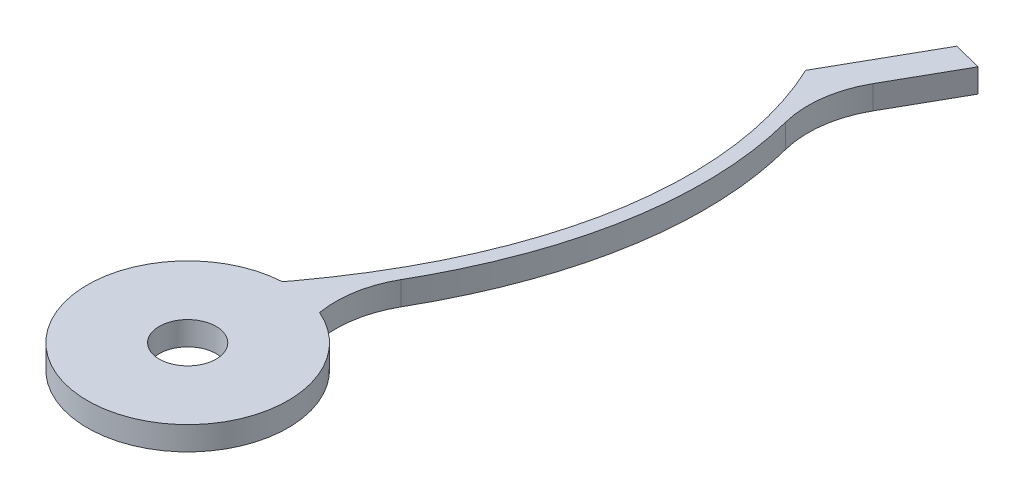
ISO-10303-21;
HEADER;
FILE_DESCRIPTION(('STEP AP214'),'2;1');
FILE_NAME('part.step','',(''),(''),'','','');
FILE_SCHEMA(('AUTOMOTIVE_DESIGN { 1 0 10303 214 1 1 1 1 }'));
ENDSEC;
DATA;
#1=APPLICATION_CONTEXT('core data for automotive mechanical design processes');
#2=APPLICATION_PROTOCOL_DEFINITION('international standard','automotive_design',2000,#1);
#3=PRODUCT_CONTEXT('',#1,'mechanical');
#4=PRODUCT('Part','Part','',(#3));
#5=PRODUCT_RELATED_PRODUCT_CATEGORY('part','',(#4));
#6=PRODUCT_DEFINITION_FORMATION('','',#4);
#7=PRODUCT_DEFINITION_CONTEXT('part definition',#1,'design');
#8=PRODUCT_DEFINITION('design','',#6,#7);
#9=PRODUCT_DEFINITION_SHAPE('','',#8);
#10=(LENGTH_UNIT() NAMED_UNIT(*) SI_UNIT(.MILLI.,.METRE.));
#11=(NAMED_UNIT(*) PLANE_ANGLE_UNIT() SI_UNIT($,.RADIAN.));
#12=(NAMED_UNIT(*) SI_UNIT($,.STERADIAN.) SOLID_ANGLE_UNIT());
#13=UNCERTAINTY_MEASURE_WITH_UNIT(LENGTH_MEASURE(1.E-05),#10,'distance_accuracy_value','');
#14=(GEOMETRIC_REPRESENTATION_CONTEXT(3) GLOBAL_UNCERTAINTY_ASSIGNED_CONTEXT((#13)) GLOBAL_UNIT_ASSIGNED_CONTEXT((#10,
#11,#12)) REPRESENTATION_CONTEXT('',''));
#15=CARTESIAN_POINT('',(0.,0.,0.));
#16=DIRECTION('',(0.,0.,1.));
#17=DIRECTION('',(1.,0.,0.));
#18=AXIS2_PLACEMENT_3D('',#15,#16,#17);
#19=CARTESIAN_POINT('',(11.8675501428549,2.5,-33.8685295956672));
#20=DIRECTION('',(0.,-1.,0.));
#21=DIRECTION('',(0.,0.,-1.));
#22=AXIS2_PLACEMENT_3D('',#19,#20,#21);
#23=PLANE('',#22);
#24=CARTESIAN_POINT('',(11.4150698163186,2.5,-51.7334515283939));
#25=CARTESIAN_POINT('',(12.1757867089268,2.5,-48.79707643159));
#26=CARTESIAN_POINT('',(12.5663248509206,2.5,-45.8331619562128));
#27=CARTESIAN_POINT('',(12.664547893608,2.5,-41.3510165104432));
#28=CARTESIAN_POINT('',(12.6150352853826,2.5,-39.8508487857379));
#29=CARTESIAN_POINT('',(12.4203734323844,2.5,-37.5916405884885));
#30=CARTESIAN_POINT('',(12.335497701668,2.5,-36.8391760505046));
#31=CARTESIAN_POINT('',(12.1289082199957,2.5,-35.3470328388975));
#32=CARTESIAN_POINT('',(12.0070530035966,2.5,-34.6055836685896));
#33=CARTESIAN_POINT('',(11.309538699888,2.5,-30.920313303978));
#34=CARTESIAN_POINT('',(10.4714504222204,2.5,-28.0418493792378));
#35=CARTESIAN_POINT('',(9.12043106125453,2.5,-24.5193326554462));
#36=CARTESIAN_POINT('',(8.8348533137372,2.5,-23.8186311344001));
#37=CARTESIAN_POINT('',(8.23736757901786,2.5,-22.4323974546413));
#38=CARTESIAN_POINT('',(7.92508461816668,2.5,-21.7458469304644));
#39=CARTESIAN_POINT('',(6.94938953569881,2.5,-19.7050339584677));
#40=CARTESIAN_POINT('',(6.24722474914609,2.5,-18.3695647510669));
#41=CARTESIAN_POINT('',(5.49734112695883,2.5,-17.0572369599294));
#42=B_SPLINE_CURVE_WITH_KNOTS('',3,(#24,#25,#26,#27,#28,#29,#30,#31,#32,#33,#34,#35,#36,#37,#38,
#39,#40,#41),.UNSPECIFIED.,.F.,.F.,(4,2,2,2,2,2,2,2,4),(0.,0.25,0.375,0.4375,0.5,0.75,0.8125,
0.875,1.),.UNSPECIFIED.);
#43=CARTESIAN_POINT('',(5.49734112695882,2.5,-17.0572369599294));
#44=VERTEX_POINT('',#43);
#45=CARTESIAN_POINT('',(11.4150698163186,2.5,-51.7334515283939));
#46=VERTEX_POINT('',#45);
#47=EDGE_CURVE('E171',#44,#46,#42,.F.);
#48=ORIENTED_EDGE('',*,*,#47,.T.);
#49=CARTESIAN_POINT('',(22.0635337424213,2.5,-54.4921135255385));
#50=DIRECTION('',(0.,-1.,0.));
#51=DIRECTION('',(0.,0.,1.));
#52=AXIS2_PLACEMENT_3D('',#49,#50,#51);
#53=CIRCLE('',#52,11.);
#54=CARTESIAN_POINT('',(12.490570584712,2.5,-59.9104505749606));
#55=VERTEX_POINT('',#54);
#56=EDGE_CURVE('E100',#46,#55,#53,.T.);
#57=ORIENTED_EDGE('',*,*,#56,.T.);
#58=DIRECTION('',(0.49257609540201,0.,-0.870269377973573));
#59=VECTOR('',#58,1.);
#60=CARTESIAN_POINT('',(12.490570584712,2.5,-59.9104505749606));
#61=LINE('',#60,#59);
#62=CARTESIAN_POINT('',(16.5043847689857,2.5,-67.0019428460147));
#63=VERTEX_POINT('',#62);
#64=EDGE_CURVE('E225',#55,#63,#61,.T.);
#65=ORIENTED_EDGE('',*,*,#64,.T.);
#66=DIRECTION('',(-0.968103742663561,0.,-0.250549682579734));
#67=VECTOR('',#66,1.);
#68=CARTESIAN_POINT('',(16.5043847689857,2.5,-67.0019428460147));
#69=LINE('',#68,#67);
#70=CARTESIAN_POINT('',(13.4976205341298,2.5,-67.780107201172));
#71=VERTEX_POINT('',#70);
#72=EDGE_CURVE('E230',#63,#71,#69,.T.);
#73=ORIENTED_EDGE('',*,*,#72,.T.);
#74=DIRECTION('',(-0.492576095651795,0.,0.870269377832193));
#75=VECTOR('',#74,1.);
#76=CARTESIAN_POINT('',(13.4976205341298,2.5,-67.780107201172));
#77=LINE('',#76,#75);
#78=CARTESIAN_POINT('',(7.72407132798658,2.5,-57.579565356237));
#79=VERTEX_POINT('',#78);
#80=EDGE_CURVE('E232',#71,#79,#77,.T.);
#81=ORIENTED_EDGE('',*,*,#80,.T.);
#82=CARTESIAN_POINT('',(7.72407132798658,2.5,-57.579565356237));
#83=CARTESIAN_POINT('',(14.1932488491802,2.5,-43.730948360992));
#84=CARTESIAN_POINT('',(11.4173226183989,2.5,-26.8436156890794));
#85=CARTESIAN_POINT('',(-0.0984748404365722,2.5,-11.2294262101174));
#86=B_SPLINE_CURVE_WITH_KNOTS('',3,(#82,#83,#84,#85),.UNSPECIFIED.,.F.,.F.,(4,4),
(0.117374876678935,0.726153685810623),.UNSPECIFIED.);
#87=CARTESIAN_POINT('',(-0.0984748404365653,2.5,-11.2294262101174));
#88=VERTEX_POINT('',#87);
#89=EDGE_CURVE('E122',#79,#88,#86,.T.);
#90=ORIENTED_EDGE('',*,*,#89,.T.);
#91=CARTESIAN_POINT('',(-8.14642200818147,2.5,-17.1649587376322));
#92=DIRECTION('',(0.,-1.,0.));
#93=DIRECTION('',(0.,0.,1.));
#94=AXIS2_PLACEMENT_3D('',#91,#92,#93);
#95=CIRCLE('',#94,9.99999999999999);
#96=CARTESIAN_POINT('',(-0.618902027845726,2.5,-10.5819166638151));
#97=VERTEX_POINT('',#96);
#98=EDGE_CURVE('E116',#88,#97,#95,.T.);
#99=ORIENTED_EDGE('',*,*,#98,.T.);
#100=CARTESIAN_POINT('',(0.,2.5,0.));
#101=DIRECTION('',(0.,1.,0.));
#102=DIRECTION('',(0.,0.,1.));
#103=AXIS2_PLACEMENT_3D('',#100,#101,#102);
#104=CIRCLE('',#103,10.6);
#105=CARTESIAN_POINT('',(4.20835974877881,2.5,-9.72880816055381));
#106=VERTEX_POINT('',#105);
#107=EDGE_CURVE('E120',#97,#106,#104,.T.);
#108=ORIENTED_EDGE('',*,*,#107,.T.);
#109=CARTESIAN_POINT('',(15.0480720345684,2.5,-11.5998072416068));
#110=DIRECTION('',(0.,-1.,0.));
#111=DIRECTION('',(0.,0.,1.));
#112=AXIS2_PLACEMENT_3D('',#109,#110,#111);
#113=CIRCLE('',#112,11.);
#114=EDGE_CURVE('E54',#106,#44,#113,.T.);
#115=ORIENTED_EDGE('',*,*,#114,.T.);
#116=EDGE_LOOP('',(#48,#57,#65,#73,#81,#90,#99,#108,#115));
#117=FACE_BOUND('',#116,.T.);
#118=CARTESIAN_POINT('',(0.,2.5,0.));
#119=DIRECTION('',(0.,1.,0.));
#120=DIRECTION('',(0.,0.,1.));
#121=AXIS2_PLACEMENT_3D('',#118,#119,#120);
#122=CIRCLE('',#121,3.);
#123=CARTESIAN_POINT('',(0.,2.5,3.));
#124=VERTEX_POINT('',#123);
#125=EDGE_CURVE('E211',#124,#124,#122,.T.);
#126=ORIENTED_EDGE('',*,*,#125,.F.);
#127=EDGE_LOOP('',(#126));
#128=FACE_BOUND('',#127,.T.);
#129=ADVANCED_FACE('F33',(#117,#128),#23,.F.);
#130=CARTESIAN_POINT('',(11.8675501428549,0.,-33.8685295956672));
#131=DIRECTION('',(0.,-1.,0.));
#132=DIRECTION('',(0.,0.,-1.));
#133=AXIS2_PLACEMENT_3D('',#130,#131,#132);
#134=PLANE('',#133);
#135=CARTESIAN_POINT('',(5.49734112695883,0.,-17.0572369599294));
#136=CARTESIAN_POINT('',(6.24722474914609,0.,-18.3695647510669));
#137=CARTESIAN_POINT('',(6.94938953569881,0.,-19.7050339584677));
#138=CARTESIAN_POINT('',(7.92508461816668,0.,-21.7458469304644));
#139=CARTESIAN_POINT('',(8.23736757901786,0.,-22.4323974546413));
#140=CARTESIAN_POINT('',(8.8348533137372,0.,-23.8186311344001));
#141=CARTESIAN_POINT('',(9.12043106125453,0.,-24.5193326554462));
#142=CARTESIAN_POINT('',(10.4714504222204,0.,-28.0418493792378));
#143=CARTESIAN_POINT('',(11.309538699888,0.,-30.920313303978));
#144=CARTESIAN_POINT('',(12.0070530035966,0.,-34.6055836685896));
#145=CARTESIAN_POINT('',(12.1289082199957,0.,-35.3470328388975));
#146=CARTESIAN_POINT('',(12.335497701668,0.,-36.8391760505046));
#147=CARTESIAN_POINT('',(12.4203734323844,0.,-37.5916405884885));
#148=CARTESIAN_POINT('',(12.6150352853826,0.,-39.8508487857379));
#149=CARTESIAN_POINT('',(12.664547893608,0.,-41.3510165104432));
#150=CARTESIAN_POINT('',(12.5663248509206,0.,-45.8331619562128));
#151=CARTESIAN_POINT('',(12.1757867089268,0.,-48.79707643159));
#152=CARTESIAN_POINT('',(11.4150698163186,0.,-51.7334515283939));
#153=B_SPLINE_CURVE_WITH_KNOTS('',3,(#135,#136,#137,#138,#139,#140,#141,#142,#143,#144,#145,
#146,#147,#148,#149,#150,#151,#152),.UNSPECIFIED.,.F.,.F.,(4,2,2,2,2,2,2,2,4),(0.,0.125,0.1875,
0.25,0.5,0.5625,0.625,0.75,1.),.UNSPECIFIED.);
#154=CARTESIAN_POINT('',(5.49734112695882,0.,-17.0572369599294));
#155=VERTEX_POINT('',#154);
#156=CARTESIAN_POINT('',(11.4150698163186,0.,-51.7334515283939));
#157=VERTEX_POINT('',#156);
#158=EDGE_CURVE('E209',#155,#157,#153,.T.);
#159=ORIENTED_EDGE('',*,*,#158,.F.);
#160=CARTESIAN_POINT('',(15.0480720345684,0.,-11.5998072416068));
#161=DIRECTION('',(0.,-1.,0.));
#162=DIRECTION('',(0.,0.,1.));
#163=AXIS2_PLACEMENT_3D('',#160,#161,#162);
#164=CIRCLE('',#163,11.);
#165=CARTESIAN_POINT('',(4.20835974877881,0.,-9.72880816055381));
#166=VERTEX_POINT('',#165);
#167=EDGE_CURVE('E92',#166,#155,#164,.T.);
#168=ORIENTED_EDGE('',*,*,#167,.F.);
#169=CARTESIAN_POINT('',(0.,0.,0.));
#170=DIRECTION('',(0.,1.,0.));
#171=DIRECTION('',(0.,0.,1.));
#172=AXIS2_PLACEMENT_3D('',#169,#170,#171);
#173=CIRCLE('',#172,10.6);
#174=CARTESIAN_POINT('',(-0.618902027845726,0.,-10.5819166638151));
#175=VERTEX_POINT('',#174);
#176=EDGE_CURVE('E86',#175,#166,#173,.T.);
#177=ORIENTED_EDGE('',*,*,#176,.F.);
#178=CARTESIAN_POINT('',(-8.14642200818147,0.,-17.1649587376322));
#179=DIRECTION('',(0.,-1.,0.));
#180=DIRECTION('',(0.,0.,1.));
#181=AXIS2_PLACEMENT_3D('',#178,#179,#180);
#182=CIRCLE('',#181,9.99999999999999);
#183=CARTESIAN_POINT('',(-0.0984748404365653,0.,-11.2294262101174));
#184=VERTEX_POINT('',#183);
#185=EDGE_CURVE('E130',#184,#175,#182,.T.);
#186=ORIENTED_EDGE('',*,*,#185,.F.);
#187=CARTESIAN_POINT('',(7.72407132798658,0.,-57.579565356237));
#188=CARTESIAN_POINT('',(14.1932488491802,0.,-43.730948360992));
#189=CARTESIAN_POINT('',(11.4173226183989,0.,-26.8436156890794));
#190=CARTESIAN_POINT('',(-0.0984748404365722,0.,-11.2294262101174));
#191=B_SPLINE_CURVE_WITH_KNOTS('',3,(#187,#188,#189,#190),.UNSPECIFIED.,.F.,.F.,(4,4),
(0.117374876678935,0.726153685810623),.UNSPECIFIED.);
#192=CARTESIAN_POINT('',(7.72407132798658,0.,-57.579565356237));
#193=VERTEX_POINT('',#192);
#194=EDGE_CURVE('E147',#193,#184,#191,.T.);
#195=ORIENTED_EDGE('',*,*,#194,.F.);
#196=DIRECTION('',(-0.492576095651795,0.,0.870269377832193));
#197=VECTOR('',#196,1.);
#198=CARTESIAN_POINT('',(13.4976205341298,0.,-67.780107201172));
#199=LINE('',#198,#197);
#200=CARTESIAN_POINT('',(13.4976205341298,0.,-67.780107201172));
#201=VERTEX_POINT('',#200);
#202=EDGE_CURVE('E145',#201,#193,#199,.T.);
#203=ORIENTED_EDGE('',*,*,#202,.F.);
#204=DIRECTION('',(-0.968103742663561,0.,-0.250549682579734));
#205=VECTOR('',#204,1.);
#206=CARTESIAN_POINT('',(16.5043847689857,0.,-67.0019428460147));
#207=LINE('',#206,#205);
#208=CARTESIAN_POINT('',(16.5043847689857,0.,-67.0019428460147));
#209=VERTEX_POINT('',#208);
#210=EDGE_CURVE('E142',#209,#201,#207,.T.);
#211=ORIENTED_EDGE('',*,*,#210,.F.);
#212=DIRECTION('',(0.49257609540201,0.,-0.870269377973573));
#213=VECTOR('',#212,1.);
#214=CARTESIAN_POINT('',(12.490570584712,0.,-59.9104505749606));
#215=LINE('',#214,#213);
#216=CARTESIAN_POINT('',(12.490570584712,0.,-59.9104505749606));
#217=VERTEX_POINT('',#216);
#218=EDGE_CURVE('E140',#217,#209,#215,.T.);
#219=ORIENTED_EDGE('',*,*,#218,.F.);
#220=CARTESIAN_POINT('',(22.0635337424213,0.,-54.4921135255385));
#221=DIRECTION('',(0.,-1.,0.));
#222=DIRECTION('',(0.,0.,1.));
#223=AXIS2_PLACEMENT_3D('',#220,#221,#222);
#224=CIRCLE('',#223,11.);
#225=EDGE_CURVE('E143',#157,#217,#224,.T.);
#226=ORIENTED_EDGE('',*,*,#225,.F.);
#227=EDGE_LOOP('',(#159,#168,#177,#186,#195,#203,#211,#219,#226));
#228=FACE_BOUND('',#227,.T.);
#229=CARTESIAN_POINT('',(0.,0.,0.));
#230=DIRECTION('',(0.,1.,0.));
#231=DIRECTION('',(0.,0.,1.));
#232=AXIS2_PLACEMENT_3D('',#229,#230,#231);
#233=CIRCLE('',#232,3.);
#234=CARTESIAN_POINT('',(0.,0.,3.));
#235=VERTEX_POINT('',#234);
#236=EDGE_CURVE('E215',#235,#235,#233,.T.);
#237=ORIENTED_EDGE('',*,*,#236,.T.);
#238=EDGE_LOOP('',(#237));
#239=FACE_BOUND('',#238,.T.);
#240=ADVANCED_FACE('F187',(#228,#239),#134,.T.);
#241=CARTESIAN_POINT('',(5.49734112695883,2.5,-17.0572369599294));
#242=CARTESIAN_POINT('',(6.24722474914609,2.5,-18.3695647510669));
#243=CARTESIAN_POINT('',(6.94938953569881,2.5,-19.7050339584677));
#244=CARTESIAN_POINT('',(7.92508461816668,2.5,-21.7458469304644));
#245=CARTESIAN_POINT('',(8.23736757901786,2.5,-22.4323974546413));
#246=CARTESIAN_POINT('',(8.8348533137372,2.5,-23.8186311344001));
#247=CARTESIAN_POINT('',(9.12043106125453,2.5,-24.5193326554462));
#248=CARTESIAN_POINT('',(10.4714504222204,2.5,-28.0418493792378));
#249=CARTESIAN_POINT('',(11.309538699888,2.5,-30.920313303978));
#250=CARTESIAN_POINT('',(12.0070530035966,2.5,-34.6055836685896));
#251=CARTESIAN_POINT('',(12.1289082199957,2.5,-35.3470328388975));
#252=CARTESIAN_POINT('',(12.335497701668,2.5,-36.8391760505046));
#253=CARTESIAN_POINT('',(12.4203734323844,2.5,-37.5916405884885));
#254=CARTESIAN_POINT('',(12.6150352853826,2.5,-39.8508487857379));
#255=CARTESIAN_POINT('',(12.664547893608,2.5,-41.3510165104432));
#256=CARTESIAN_POINT('',(12.5663248509206,2.5,-45.8331619562128));
#257=CARTESIAN_POINT('',(12.1757867089268,2.5,-48.79707643159));
#258=CARTESIAN_POINT('',(11.4150698163186,2.5,-51.7334515283939));
#259=B_SPLINE_CURVE_WITH_KNOTS('',3,(#241,#242,#243,#244,#245,#246,#247,#248,#249,#250,#251,
#252,#253,#254,#255,#256,#257,#258),.UNSPECIFIED.,.F.,.F.,(4,2,2,2,2,2,2,2,4),(0.,0.125,0.1875,
0.25,0.5,0.5625,0.625,0.75,1.),.UNSPECIFIED.);
#260=DIRECTION('',(0.,-1.,0.));
#261=VECTOR('',#260,1.);
#262=SURFACE_OF_LINEAR_EXTRUSION('',#259,#261);
#263=ORIENTED_EDGE('',*,*,#158,.T.);
#264=DIRECTION('',(0.,-1.,0.));
#265=VECTOR('',#264,1.);
#266=CARTESIAN_POINT('',(11.4150698163186,2.5,-51.7334515283939));
#267=LINE('',#266,#265);
#268=EDGE_CURVE('E11',#46,#157,#267,.T.);
#269=ORIENTED_EDGE('',*,*,#268,.F.);
#270=ORIENTED_EDGE('',*,*,#47,.F.);
#271=DIRECTION('',(0.,-1.,0.));
#272=VECTOR('',#271,1.);
#273=CARTESIAN_POINT('',(5.49734112695882,2.5,-17.0572369599294));
#274=LINE('',#273,#272);
#275=EDGE_CURVE('E136',#44,#155,#274,.T.);
#276=ORIENTED_EDGE('',*,*,#275,.T.);
#277=EDGE_LOOP('',(#263,#269,#270,#276));
#278=FACE_BOUND('',#277,.T.);
#279=ADVANCED_FACE('F35',(#278),#262,.F.);
#280=CARTESIAN_POINT('',(22.0635337424213,2.5,-54.4921135255385));
#281=DIRECTION('',(0.,-1.,0.));
#282=DIRECTION('',(0.,0.,-1.));
#283=AXIS2_PLACEMENT_3D('',#280,#281,#282);
#284=CYLINDRICAL_SURFACE('',#283,11.);
#285=ORIENTED_EDGE('',*,*,#225,.T.);
#286=DIRECTION('',(0.,-1.,0.));
#287=VECTOR('',#286,1.);
#288=CARTESIAN_POINT('',(12.490570584712,2.5,-59.9104505749606));
#289=LINE('',#288,#287);
#290=EDGE_CURVE('E45',#55,#217,#289,.T.);
#291=ORIENTED_EDGE('',*,*,#290,.F.);
#292=ORIENTED_EDGE('',*,*,#56,.F.);
#293=ORIENTED_EDGE('',*,*,#268,.T.);
#294=EDGE_LOOP('',(#285,#291,#292,#293));
#295=FACE_BOUND('',#294,.T.);
#296=ADVANCED_FACE('F255',(#295),#284,.F.);
#297=CARTESIAN_POINT('',(12.490570584712,2.5,-59.9104505749606));
#298=DIRECTION('',(-0.870269377973573,0.,-0.49257609540201));
#299=DIRECTION('',(-0.49257609540201,0.,0.870269377973574));
#300=AXIS2_PLACEMENT_3D('',#297,#298,#299);
#301=PLANE('',#300);
#302=ORIENTED_EDGE('',*,*,#218,.T.);
#303=DIRECTION('',(0.,-1.,0.));
#304=VECTOR('',#303,1.);
#305=CARTESIAN_POINT('',(16.5043847689857,2.5,-67.0019428460147));
#306=LINE('',#305,#304);
#307=EDGE_CURVE('E164',#63,#209,#306,.T.);
#308=ORIENTED_EDGE('',*,*,#307,.F.);
#309=ORIENTED_EDGE('',*,*,#64,.F.);
#310=ORIENTED_EDGE('',*,*,#290,.T.);
#311=EDGE_LOOP('',(#302,#308,#309,#310));
#312=FACE_BOUND('',#311,.T.);
#313=ADVANCED_FACE('F252',(#312),#301,.F.);
#314=CARTESIAN_POINT('',(16.5043847689857,2.5,-67.0019428460147));
#315=DIRECTION('',(-0.250549682579734,0.,0.968103742663561));
#316=DIRECTION('',(0.968103742663561,0.,0.250549682579734));
#317=AXIS2_PLACEMENT_3D('',#314,#315,#316);
#318=PLANE('',#317);
#319=ORIENTED_EDGE('',*,*,#210,.T.);
#320=DIRECTION('',(0.,-1.,0.));
#321=VECTOR('',#320,1.);
#322=CARTESIAN_POINT('',(13.4976205341298,2.5,-67.780107201172));
#323=LINE('',#322,#321);
#324=EDGE_CURVE('E161',#71,#201,#323,.T.);
#325=ORIENTED_EDGE('',*,*,#324,.F.);
#326=ORIENTED_EDGE('',*,*,#72,.F.);
#327=ORIENTED_EDGE('',*,*,#307,.T.);
#328=EDGE_LOOP('',(#319,#325,#326,#327));
#329=FACE_BOUND('',#328,.T.);
#330=ADVANCED_FACE('F248',(#329),#318,.F.);
#331=CARTESIAN_POINT('',(13.4976205341298,2.5,-67.780107201172));
#332=DIRECTION('',(0.870269377832194,0.,0.492576095651795));
#333=DIRECTION('',(0.492576095651795,0.,-0.870269377832194));
#334=AXIS2_PLACEMENT_3D('',#331,#332,#333);
#335=PLANE('',#334);
#336=ORIENTED_EDGE('',*,*,#202,.T.);
#337=DIRECTION('',(0.,-1.,0.));
#338=VECTOR('',#337,1.);
#339=CARTESIAN_POINT('',(7.72407132798658,2.5,-57.579565356237));
#340=LINE('',#339,#338);
#341=EDGE_CURVE('E158',#79,#193,#340,.T.);
#342=ORIENTED_EDGE('',*,*,#341,.F.);
#343=ORIENTED_EDGE('',*,*,#80,.F.);
#344=ORIENTED_EDGE('',*,*,#324,.T.);
#345=EDGE_LOOP('',(#336,#342,#343,#344));
#346=FACE_BOUND('',#345,.T.);
#347=ADVANCED_FACE('F244',(#346),#335,.F.);
#348=DIRECTION('',(0.,-1.,0.));
#349=VECTOR('',#348,1.);
#350=SURFACE_OF_LINEAR_EXTRUSION('',#86,#349);
#351=ORIENTED_EDGE('',*,*,#194,.T.);
#352=DIRECTION('',(0.,-1.,0.));
#353=VECTOR('',#352,1.);
#354=CARTESIAN_POINT('',(-0.0984748404365653,2.5,-11.2294262101174));
#355=LINE('',#354,#353);
#356=EDGE_CURVE('E131',#88,#184,#355,.T.);
#357=ORIENTED_EDGE('',*,*,#356,.F.);
#358=ORIENTED_EDGE('',*,*,#89,.F.);
#359=ORIENTED_EDGE('',*,*,#341,.T.);
#360=EDGE_LOOP('',(#351,#357,#358,#359));
#361=FACE_BOUND('',#360,.T.);
#362=ADVANCED_FACE('F240',(#361),#350,.F.);
#363=CARTESIAN_POINT('',(-8.14642200818147,2.5,-17.1649587376322));
#364=DIRECTION('',(0.,-1.,0.));
#365=DIRECTION('',(0.,0.,-1.));
#366=AXIS2_PLACEMENT_3D('',#363,#364,#365);
#367=CYLINDRICAL_SURFACE('',#366,9.99999999999999);
#368=ORIENTED_EDGE('',*,*,#185,.T.);
#369=DIRECTION('',(0.,-1.,0.));
#370=VECTOR('',#369,1.);
#371=CARTESIAN_POINT('',(-0.618902027845726,2.5,-10.5819166638151));
#372=LINE('',#371,#370);
#373=EDGE_CURVE('E127',#97,#175,#372,.T.);
#374=ORIENTED_EDGE('',*,*,#373,.F.);
#375=ORIENTED_EDGE('',*,*,#98,.F.);
#376=ORIENTED_EDGE('',*,*,#356,.T.);
#377=EDGE_LOOP('',(#368,#374,#375,#376));
#378=FACE_BOUND('',#377,.T.);
#379=ADVANCED_FACE('F128',(#378),#367,.F.);
#380=CARTESIAN_POINT('',(0.,2.5,0.));
#381=DIRECTION('',(0.,-1.,0.));
#382=DIRECTION('',(0.,0.,-1.));
#383=AXIS2_PLACEMENT_3D('',#380,#381,#382);
#384=CYLINDRICAL_SURFACE('',#383,10.6);
#385=ORIENTED_EDGE('',*,*,#176,.T.);
#386=DIRECTION('',(0.,-1.,0.));
#387=VECTOR('',#386,1.);
#388=CARTESIAN_POINT('',(4.20835974877881,2.5,-9.72880816055381));
#389=LINE('',#388,#387);
#390=EDGE_CURVE('E132',#106,#166,#389,.T.);
#391=ORIENTED_EDGE('',*,*,#390,.F.);
#392=ORIENTED_EDGE('',*,*,#107,.F.);
#393=ORIENTED_EDGE('',*,*,#373,.T.);
#394=EDGE_LOOP('',(#385,#391,#392,#393));
#395=FACE_BOUND('',#394,.T.);
#396=ADVANCED_FACE('F134',(#395),#384,.T.);
#397=CARTESIAN_POINT('',(15.0480720345684,2.5,-11.5998072416068));
#398=DIRECTION('',(0.,-1.,0.));
#399=DIRECTION('',(0.,0.,-1.));
#400=AXIS2_PLACEMENT_3D('',#397,#398,#399);
#401=CYLINDRICAL_SURFACE('',#400,11.);
#402=ORIENTED_EDGE('',*,*,#167,.T.);
#403=ORIENTED_EDGE('',*,*,#275,.F.);
#404=ORIENTED_EDGE('',*,*,#114,.F.);
#405=ORIENTED_EDGE('',*,*,#390,.T.);
#406=EDGE_LOOP('',(#402,#403,#404,#405));
#407=FACE_BOUND('',#406,.T.);
#408=ADVANCED_FACE('F193',(#407),#401,.F.);
#409=CARTESIAN_POINT('',(0.,2.5,0.));
#410=DIRECTION('',(0.,-1.,0.));
#411=DIRECTION('',(0.,0.,-1.));
#412=AXIS2_PLACEMENT_3D('',#409,#410,#411);
#413=CYLINDRICAL_SURFACE('',#412,3.);
#414=ORIENTED_EDGE('',*,*,#125,.T.);
#415=EDGE_LOOP('',(#414));
#416=FACE_BOUND('',#415,.T.);
#417=ORIENTED_EDGE('',*,*,#236,.F.);
#418=EDGE_LOOP('',(#417));
#419=FACE_BOUND('',#418,.T.);
#420=ADVANCED_FACE('F188',(#416,#419),#413,.F.);
#421=CLOSED_SHELL('',(#129,#240,#279,#296,#313,#330,#347,#362,#379,#396,#408,#420));
#422=MANIFOLD_SOLID_BREP('B2',#421);
#423=ADVANCED_BREP_SHAPE_REPRESENTATION('',(#18,#422),#14);
#424=SHAPE_DEFINITION_REPRESENTATION(#9,#423);
ENDSEC;
END-ISO-10303-21;
